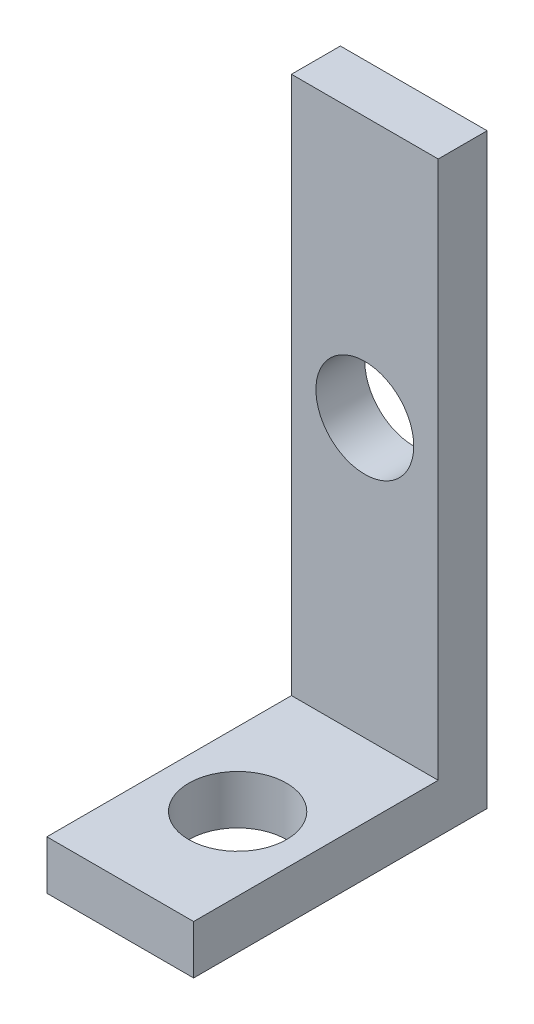
ISO-10303-21;
HEADER;
FILE_DESCRIPTION(('STEP AP214'),'2;1');
FILE_NAME('part.step','',(''),(''),'','','');
FILE_SCHEMA(('AUTOMOTIVE_DESIGN { 1 0 10303 214 1 1 1 1 }'));
ENDSEC;
DATA;
#1=APPLICATION_CONTEXT('core data for automotive mechanical design processes');
#2=APPLICATION_PROTOCOL_DEFINITION('international standard','automotive_design',2000,#1);
#3=PRODUCT_CONTEXT('',#1,'mechanical');
#4=PRODUCT('Part','Part','',(#3));
#5=PRODUCT_RELATED_PRODUCT_CATEGORY('part','',(#4));
#6=PRODUCT_DEFINITION_FORMATION('','',#4);
#7=PRODUCT_DEFINITION_CONTEXT('part definition',#1,'design');
#8=PRODUCT_DEFINITION('design','',#6,#7);
#9=PRODUCT_DEFINITION_SHAPE('','',#8);
#10=(LENGTH_UNIT() NAMED_UNIT(*) SI_UNIT(.MILLI.,.METRE.));
#11=(NAMED_UNIT(*) PLANE_ANGLE_UNIT() SI_UNIT($,.RADIAN.));
#12=(NAMED_UNIT(*) SI_UNIT($,.STERADIAN.) SOLID_ANGLE_UNIT());
#13=UNCERTAINTY_MEASURE_WITH_UNIT(LENGTH_MEASURE(1.E-05),#10,'distance_accuracy_value','');
#14=(GEOMETRIC_REPRESENTATION_CONTEXT(3) GLOBAL_UNCERTAINTY_ASSIGNED_CONTEXT((#13)) GLOBAL_UNIT_ASSIGNED_CONTEXT((#10,
#11,#12)) REPRESENTATION_CONTEXT('',''));
#15=CARTESIAN_POINT('',(0.,0.,0.));
#16=DIRECTION('',(0.,0.,1.));
#17=DIRECTION('',(1.,0.,0.));
#18=AXIS2_PLACEMENT_3D('',#15,#16,#17);
#19=CARTESIAN_POINT('',(0.,0.,1.27));
#20=DIRECTION('',(0.,0.,-1.));
#21=DIRECTION('',(-1.,0.,0.));
#22=AXIS2_PLACEMENT_3D('',#19,#20,#21);
#23=PLANE('',#22);
#24=CARTESIAN_POINT('',(1.905,8.46666666666582,1.27));
#25=DIRECTION('',(0.,0.,1.));
#26=DIRECTION('',(1.,0.,0.));
#27=AXIS2_PLACEMENT_3D('',#24,#25,#26);
#28=CIRCLE('',#27,1.27);
#29=CARTESIAN_POINT('',(3.175,8.46666666666582,1.27));
#30=VERTEX_POINT('',#29);
#31=EDGE_CURVE('E147',#30,#30,#28,.T.);
#32=ORIENTED_EDGE('',*,*,#31,.F.);
#33=EDGE_LOOP('',(#32));
#34=FACE_BOUND('',#33,.T.);
#35=DIRECTION('',(-1.,0.,0.));
#36=VECTOR('',#35,1.);
#37=CARTESIAN_POINT('',(0.,1.27,1.27));
#38=LINE('',#37,#36);
#39=CARTESIAN_POINT('',(3.81,1.27,1.27));
#40=VERTEX_POINT('',#39);
#41=CARTESIAN_POINT('',(0.,1.27,1.27));
#42=VERTEX_POINT('',#41);
#43=EDGE_CURVE('E49',#40,#42,#38,.T.);
#44=ORIENTED_EDGE('',*,*,#43,.F.);
#45=DIRECTION('',(0.,1.,0.));
#46=VECTOR('',#45,1.);
#47=CARTESIAN_POINT('',(3.81,0.,1.27));
#48=LINE('',#47,#46);
#49=CARTESIAN_POINT('',(3.81,15.24,1.27));
#50=VERTEX_POINT('',#49);
#51=EDGE_CURVE('E110',#40,#50,#48,.T.);
#52=ORIENTED_EDGE('',*,*,#51,.T.);
#53=DIRECTION('',(-1.,0.,0.));
#54=VECTOR('',#53,1.);
#55=CARTESIAN_POINT('',(0.,15.24,1.27));
#56=LINE('',#55,#54);
#57=CARTESIAN_POINT('',(0.,15.24,1.27));
#58=VERTEX_POINT('',#57);
#59=EDGE_CURVE('E55',#50,#58,#56,.T.);
#60=ORIENTED_EDGE('',*,*,#59,.T.);
#61=DIRECTION('',(0.,-1.,0.));
#62=VECTOR('',#61,1.);
#63=CARTESIAN_POINT('',(0.,0.,1.27));
#64=LINE('',#63,#62);
#65=EDGE_CURVE('E84',#58,#42,#64,.T.);
#66=ORIENTED_EDGE('',*,*,#65,.T.);
#67=EDGE_LOOP('',(#44,#52,#60,#66));
#68=FACE_BOUND('',#67,.T.);
#69=ADVANCED_FACE('F32',(#34,#68),#23,.F.);
#70=CARTESIAN_POINT('',(0.,0.,1.27));
#71=DIRECTION('',(1.,0.,0.));
#72=DIRECTION('',(0.,0.,-1.));
#73=AXIS2_PLACEMENT_3D('',#70,#71,#72);
#74=PLANE('',#73);
#75=DIRECTION('',(0.,-1.,0.));
#76=VECTOR('',#75,1.);
#77=CARTESIAN_POINT('',(0.,0.,0.));
#78=LINE('',#77,#76);
#79=CARTESIAN_POINT('',(0.,15.24,0.));
#80=VERTEX_POINT('',#79);
#81=CARTESIAN_POINT('',(0.,0.,0.));
#82=VERTEX_POINT('',#81);
#83=EDGE_CURVE('E90',#80,#82,#78,.T.);
#84=ORIENTED_EDGE('',*,*,#83,.T.);
#85=DIRECTION('',(0.,0.,-1.));
#86=VECTOR('',#85,1.);
#87=CARTESIAN_POINT('',(0.,0.,1.27));
#88=LINE('',#87,#86);
#89=CARTESIAN_POINT('',(0.,0.,7.62));
#90=VERTEX_POINT('',#89);
#91=EDGE_CURVE('E11',#90,#82,#88,.T.);
#92=ORIENTED_EDGE('',*,*,#91,.F.);
#93=DIRECTION('',(0.,-1.,0.));
#94=VECTOR('',#93,1.);
#95=CARTESIAN_POINT('',(0.,0.,7.62));
#96=LINE('',#95,#94);
#97=CARTESIAN_POINT('',(0.,1.27,7.62));
#98=VERTEX_POINT('',#97);
#99=EDGE_CURVE('E120',#98,#90,#96,.T.);
#100=ORIENTED_EDGE('',*,*,#99,.F.);
#101=DIRECTION('',(0.,0.,-1.));
#102=VECTOR('',#101,1.);
#103=CARTESIAN_POINT('',(0.,1.27,7.62));
#104=LINE('',#103,#102);
#105=EDGE_CURVE('E99',#98,#42,#104,.T.);
#106=ORIENTED_EDGE('',*,*,#105,.T.);
#107=ORIENTED_EDGE('',*,*,#65,.F.);
#108=DIRECTION('',(0.,0.,-1.));
#109=VECTOR('',#108,1.);
#110=CARTESIAN_POINT('',(0.,15.24,1.27));
#111=LINE('',#110,#109);
#112=EDGE_CURVE('E77',#58,#80,#111,.T.);
#113=ORIENTED_EDGE('',*,*,#112,.T.);
#114=EDGE_LOOP('',(#84,#92,#100,#106,#107,#113));
#115=FACE_BOUND('',#114,.T.);
#116=ADVANCED_FACE('F34',(#115),#74,.F.);
#117=CARTESIAN_POINT('',(0.,0.,1.27));
#118=DIRECTION('',(0.,1.,0.));
#119=DIRECTION('',(0.,0.,1.));
#120=AXIS2_PLACEMENT_3D('',#117,#118,#119);
#121=PLANE('',#120);
#122=CARTESIAN_POINT('',(1.905,0.,4.572));
#123=DIRECTION('',(0.,1.,0.));
#124=DIRECTION('',(0.,0.,1.));
#125=AXIS2_PLACEMENT_3D('',#122,#123,#124);
#126=CIRCLE('',#125,1.27);
#127=CARTESIAN_POINT('',(1.905,0.,5.842));
#128=VERTEX_POINT('',#127);
#129=EDGE_CURVE('E121',#128,#128,#126,.T.);
#130=ORIENTED_EDGE('',*,*,#129,.T.);
#131=EDGE_LOOP('',(#130));
#132=FACE_BOUND('',#131,.T.);
#133=DIRECTION('',(1.,0.,0.));
#134=VECTOR('',#133,1.);
#135=CARTESIAN_POINT('',(0.,0.,0.));
#136=LINE('',#135,#134);
#137=CARTESIAN_POINT('',(3.81,0.,0.));
#138=VERTEX_POINT('',#137);
#139=EDGE_CURVE('E94',#82,#138,#136,.T.);
#140=ORIENTED_EDGE('',*,*,#139,.T.);
#141=DIRECTION('',(0.,0.,-1.));
#142=VECTOR('',#141,1.);
#143=CARTESIAN_POINT('',(3.81,0.,1.27));
#144=LINE('',#143,#142);
#145=CARTESIAN_POINT('',(3.81,0.,7.62));
#146=VERTEX_POINT('',#145);
#147=EDGE_CURVE('E41',#146,#138,#144,.T.);
#148=ORIENTED_EDGE('',*,*,#147,.F.);
#149=DIRECTION('',(1.,0.,0.));
#150=VECTOR('',#149,1.);
#151=CARTESIAN_POINT('',(0.,0.,7.62));
#152=LINE('',#151,#150);
#153=EDGE_CURVE('E134',#90,#146,#152,.T.);
#154=ORIENTED_EDGE('',*,*,#153,.F.);
#155=ORIENTED_EDGE('',*,*,#91,.T.);
#156=EDGE_LOOP('',(#140,#148,#154,#155));
#157=FACE_BOUND('',#156,.T.);
#158=ADVANCED_FACE('F174',(#132,#157),#121,.F.);
#159=CARTESIAN_POINT('',(3.81,0.,1.27));
#160=DIRECTION('',(-1.,0.,0.));
#161=DIRECTION('',(0.,0.,1.));
#162=AXIS2_PLACEMENT_3D('',#159,#160,#161);
#163=PLANE('',#162);
#164=DIRECTION('',(0.,1.,0.));
#165=VECTOR('',#164,1.);
#166=CARTESIAN_POINT('',(3.81,0.,0.));
#167=LINE('',#166,#165);
#168=CARTESIAN_POINT('',(3.81,15.24,0.));
#169=VERTEX_POINT('',#168);
#170=EDGE_CURVE('E85',#138,#169,#167,.T.);
#171=ORIENTED_EDGE('',*,*,#170,.T.);
#172=DIRECTION('',(0.,0.,-1.));
#173=VECTOR('',#172,1.);
#174=CARTESIAN_POINT('',(3.81,15.24,1.27));
#175=LINE('',#174,#173);
#176=EDGE_CURVE('E80',#50,#169,#175,.T.);
#177=ORIENTED_EDGE('',*,*,#176,.F.);
#178=ORIENTED_EDGE('',*,*,#51,.F.);
#179=DIRECTION('',(0.,0.,-1.));
#180=VECTOR('',#179,1.);
#181=CARTESIAN_POINT('',(3.81,1.27,7.62));
#182=LINE('',#181,#180);
#183=CARTESIAN_POINT('',(3.81,1.27,7.62));
#184=VERTEX_POINT('',#183);
#185=EDGE_CURVE('E95',#184,#40,#182,.T.);
#186=ORIENTED_EDGE('',*,*,#185,.F.);
#187=DIRECTION('',(0.,1.,0.));
#188=VECTOR('',#187,1.);
#189=CARTESIAN_POINT('',(3.81,0.,7.62));
#190=LINE('',#189,#188);
#191=EDGE_CURVE('E129',#146,#184,#190,.T.);
#192=ORIENTED_EDGE('',*,*,#191,.F.);
#193=ORIENTED_EDGE('',*,*,#147,.T.);
#194=EDGE_LOOP('',(#171,#177,#178,#186,#192,#193));
#195=FACE_BOUND('',#194,.T.);
#196=ADVANCED_FACE('F166',(#195),#163,.F.);
#197=CARTESIAN_POINT('',(0.,15.24,1.27));
#198=DIRECTION('',(0.,-1.,0.));
#199=DIRECTION('',(0.,0.,-1.));
#200=AXIS2_PLACEMENT_3D('',#197,#198,#199);
#201=PLANE('',#200);
#202=DIRECTION('',(-1.,0.,0.));
#203=VECTOR('',#202,1.);
#204=CARTESIAN_POINT('',(0.,15.24,0.));
#205=LINE('',#204,#203);
#206=EDGE_CURVE('E74',#169,#80,#205,.T.);
#207=ORIENTED_EDGE('',*,*,#206,.T.);
#208=ORIENTED_EDGE('',*,*,#112,.F.);
#209=ORIENTED_EDGE('',*,*,#59,.F.);
#210=ORIENTED_EDGE('',*,*,#176,.T.);
#211=EDGE_LOOP('',(#207,#208,#209,#210));
#212=FACE_BOUND('',#211,.T.);
#213=ADVANCED_FACE('F76',(#212),#201,.F.);
#214=CARTESIAN_POINT('',(0.,0.,0.));
#215=DIRECTION('',(0.,0.,-1.));
#216=DIRECTION('',(-1.,0.,0.));
#217=AXIS2_PLACEMENT_3D('',#214,#215,#216);
#218=PLANE('',#217);
#219=CARTESIAN_POINT('',(1.905,8.46666666666582,0.));
#220=DIRECTION('',(0.,0.,-1.));
#221=DIRECTION('',(-1.,0.,0.));
#222=AXIS2_PLACEMENT_3D('',#219,#220,#221);
#223=CIRCLE('',#222,1.27);
#224=CARTESIAN_POINT('',(0.634999999999999,8.46666666666582,0.));
#225=VERTEX_POINT('',#224);
#226=EDGE_CURVE('E36',#225,#225,#223,.T.);
#227=ORIENTED_EDGE('',*,*,#226,.F.);
#228=EDGE_LOOP('',(#227));
#229=FACE_BOUND('',#228,.T.);
#230=ORIENTED_EDGE('',*,*,#83,.F.);
#231=ORIENTED_EDGE('',*,*,#206,.F.);
#232=ORIENTED_EDGE('',*,*,#170,.F.);
#233=ORIENTED_EDGE('',*,*,#139,.F.);
#234=EDGE_LOOP('',(#230,#231,#232,#233));
#235=FACE_BOUND('',#234,.T.);
#236=ADVANCED_FACE('F93',(#229,#235),#218,.T.);
#237=CARTESIAN_POINT('',(0.,1.27,7.62));
#238=DIRECTION('',(0.,-1.,0.));
#239=DIRECTION('',(0.,0.,-1.));
#240=AXIS2_PLACEMENT_3D('',#237,#238,#239);
#241=PLANE('',#240);
#242=CARTESIAN_POINT('',(1.905,1.27,4.572));
#243=DIRECTION('',(0.,1.,0.));
#244=DIRECTION('',(0.,0.,1.));
#245=AXIS2_PLACEMENT_3D('',#242,#243,#244);
#246=CIRCLE('',#245,1.27);
#247=CARTESIAN_POINT('',(1.905,1.27,5.842));
#248=VERTEX_POINT('',#247);
#249=EDGE_CURVE('E144',#248,#248,#246,.T.);
#250=ORIENTED_EDGE('',*,*,#249,.F.);
#251=EDGE_LOOP('',(#250));
#252=FACE_BOUND('',#251,.T.);
#253=ORIENTED_EDGE('',*,*,#43,.T.);
#254=ORIENTED_EDGE('',*,*,#105,.F.);
#255=DIRECTION('',(-1.,0.,0.));
#256=VECTOR('',#255,1.);
#257=CARTESIAN_POINT('',(0.,1.27,7.62));
#258=LINE('',#257,#256);
#259=EDGE_CURVE('E117',#184,#98,#258,.T.);
#260=ORIENTED_EDGE('',*,*,#259,.F.);
#261=ORIENTED_EDGE('',*,*,#185,.T.);
#262=EDGE_LOOP('',(#253,#254,#260,#261));
#263=FACE_BOUND('',#262,.T.);
#264=ADVANCED_FACE('F157',(#252,#263),#241,.F.);
#265=CARTESIAN_POINT('',(0.,0.,7.62));
#266=DIRECTION('',(0.,0.,-1.));
#267=DIRECTION('',(-1.,0.,0.));
#268=AXIS2_PLACEMENT_3D('',#265,#266,#267);
#269=PLANE('',#268);
#270=ORIENTED_EDGE('',*,*,#99,.T.);
#271=ORIENTED_EDGE('',*,*,#153,.T.);
#272=ORIENTED_EDGE('',*,*,#191,.T.);
#273=ORIENTED_EDGE('',*,*,#259,.T.);
#274=EDGE_LOOP('',(#270,#271,#272,#273));
#275=FACE_BOUND('',#274,.T.);
#276=ADVANCED_FACE('F163',(#275),#269,.F.);
#277=CARTESIAN_POINT('',(1.905,-5.08,4.572));
#278=DIRECTION('',(0.,1.,0.));
#279=DIRECTION('',(0.,0.,1.));
#280=AXIS2_PLACEMENT_3D('',#277,#278,#279);
#281=CYLINDRICAL_SURFACE('',#280,1.27);
#282=ORIENTED_EDGE('',*,*,#249,.T.);
#283=EDGE_LOOP('',(#282));
#284=FACE_BOUND('',#283,.T.);
#285=ORIENTED_EDGE('',*,*,#129,.F.);
#286=EDGE_LOOP('',(#285));
#287=FACE_BOUND('',#286,.T.);
#288=ADVANCED_FACE('F178',(#284,#287),#281,.F.);
#289=CARTESIAN_POINT('',(1.905,8.46666666666582,-5.08));
#290=DIRECTION('',(0.,0.,1.));
#291=DIRECTION('',(1.,0.,0.));
#292=AXIS2_PLACEMENT_3D('',#289,#290,#291);
#293=CYLINDRICAL_SURFACE('',#292,1.27);
#294=ORIENTED_EDGE('',*,*,#226,.T.);
#295=EDGE_LOOP('',(#294));
#296=FACE_BOUND('',#295,.T.);
#297=ORIENTED_EDGE('',*,*,#31,.T.);
#298=EDGE_LOOP('',(#297));
#299=FACE_BOUND('',#298,.T.);
#300=ADVANCED_FACE('F154',(#296,#299),#293,.F.);
#301=CLOSED_SHELL('',(#69,#116,#158,#196,#213,#236,#264,#276,#288,#300));
#302=MANIFOLD_SOLID_BREP('B2',#301);
#303=ADVANCED_BREP_SHAPE_REPRESENTATION('',(#18,#302),#14);
#304=SHAPE_DEFINITION_REPRESENTATION(#9,#303);
ENDSEC;
END-ISO-10303-21;
